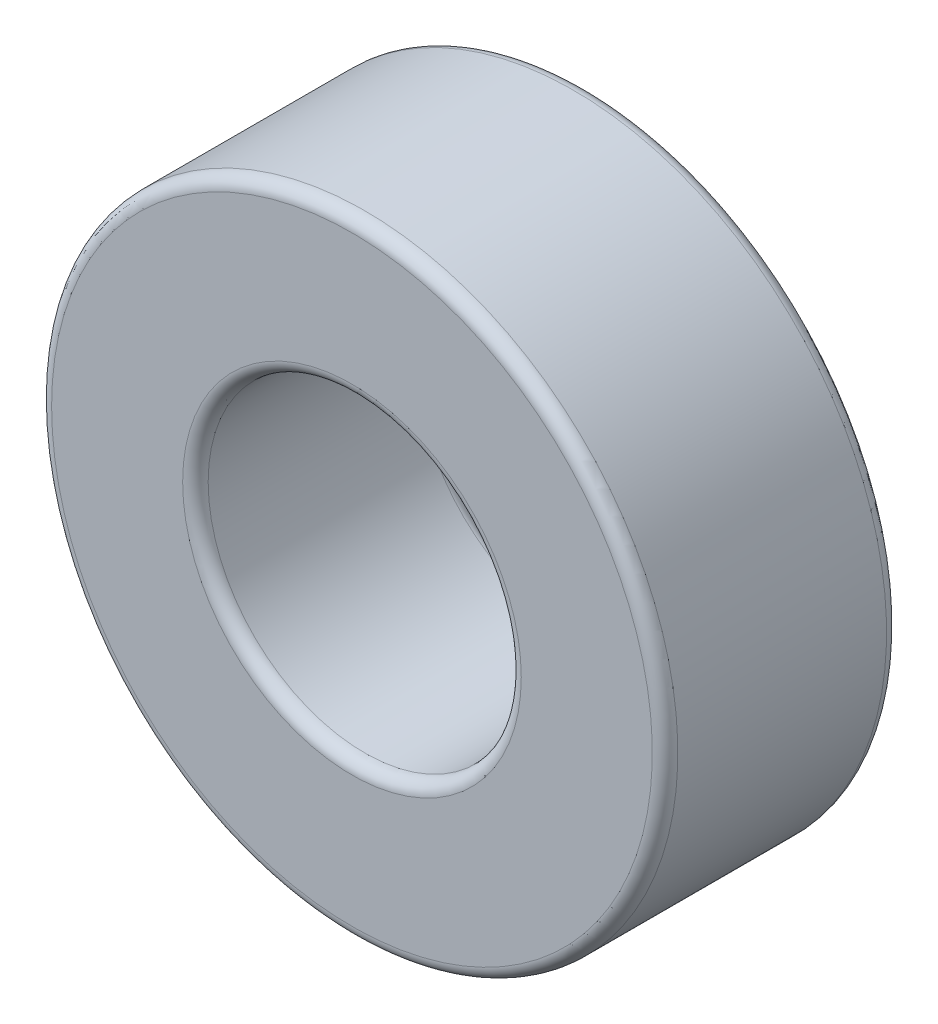
ISO-10303-21;
HEADER;
FILE_DESCRIPTION(('STEP AP214'),'2;1');
FILE_NAME('part.step','',(''),(''),'','','');
FILE_SCHEMA(('AUTOMOTIVE_DESIGN { 1 0 10303 214 1 1 1 1 }'));
ENDSEC;
DATA;
#1=APPLICATION_CONTEXT('core data for automotive mechanical design processes');
#2=APPLICATION_PROTOCOL_DEFINITION('international standard','automotive_design',2000,#1);
#3=PRODUCT_CONTEXT('',#1,'mechanical');
#4=PRODUCT('Part','Part','',(#3));
#5=PRODUCT_RELATED_PRODUCT_CATEGORY('part','',(#4));
#6=PRODUCT_DEFINITION_FORMATION('','',#4);
#7=PRODUCT_DEFINITION_CONTEXT('part definition',#1,'design');
#8=PRODUCT_DEFINITION('design','',#6,#7);
#9=PRODUCT_DEFINITION_SHAPE('','',#8);
#10=(LENGTH_UNIT() NAMED_UNIT(*) SI_UNIT(.MILLI.,.METRE.));
#11=(NAMED_UNIT(*) PLANE_ANGLE_UNIT() SI_UNIT($,.RADIAN.));
#12=(NAMED_UNIT(*) SI_UNIT($,.STERADIAN.) SOLID_ANGLE_UNIT());
#13=UNCERTAINTY_MEASURE_WITH_UNIT(LENGTH_MEASURE(1.E-05),#10,'distance_accuracy_value','');
#14=(GEOMETRIC_REPRESENTATION_CONTEXT(3) GLOBAL_UNCERTAINTY_ASSIGNED_CONTEXT((#13)) GLOBAL_UNIT_ASSIGNED_CONTEXT((#10,
#11,#12)) REPRESENTATION_CONTEXT('',''));
#15=CARTESIAN_POINT('',(0.,0.,0.));
#16=DIRECTION('',(0.,0.,1.));
#17=DIRECTION('',(1.,0.,0.));
#18=AXIS2_PLACEMENT_3D('',#15,#16,#17);
#19=CARTESIAN_POINT('',(-1.5,0.,0.));
#20=DIRECTION('',(0.,0.,-1.));
#21=DIRECTION('',(-1.,0.,0.));
#22=AXIS2_PLACEMENT_3D('',#19,#20,#21);
#23=TOROIDAL_SURFACE('',#22,1.62222222,0.12222222);
#24=CARTESIAN_POINT('',(-1.5,0.,0.12222222));
#25=DIRECTION('',(0.,0.,-1.));
#26=DIRECTION('',(-1.,0.,0.));
#27=AXIS2_PLACEMENT_3D('',#24,#25,#26);
#28=CIRCLE('',#27,1.62222222);
#29=CARTESIAN_POINT('',(-3.12222222,0.,0.12222222));
#30=VERTEX_POINT('',#29);
#31=EDGE_CURVE('E10',#30,#30,#28,.T.);
#32=ORIENTED_EDGE('',*,*,#31,.F.);
#33=EDGE_LOOP('',(#32));
#34=FACE_BOUND('',#33,.T.);
#35=CARTESIAN_POINT('',(-1.5,0.,0.));
#36=DIRECTION('',(0.,0.,-1.));
#37=DIRECTION('',(-1.,0.,0.));
#38=AXIS2_PLACEMENT_3D('',#35,#36,#37);
#39=CIRCLE('',#38,1.5);
#40=CARTESIAN_POINT('',(-3.,0.,0.));
#41=VERTEX_POINT('',#40);
#42=EDGE_CURVE('E58',#41,#41,#39,.T.);
#43=ORIENTED_EDGE('',*,*,#42,.T.);
#44=EDGE_LOOP('',(#43));
#45=FACE_BOUND('',#44,.T.);
#46=ADVANCED_FACE('F30',(#34,#45),#23,.T.);
#47=CARTESIAN_POINT('',(0.12222222,0.,0.12222222));
#48=DIRECTION('',(0.,0.,-1.));
#49=DIRECTION('',(-1.,0.,0.));
#50=AXIS2_PLACEMENT_3D('',#47,#48,#49);
#51=PLANE('',#50);
#52=CARTESIAN_POINT('',(-1.5,0.,0.12222222));
#53=DIRECTION('',(0.,0.,-1.));
#54=DIRECTION('',(-1.,0.,0.));
#55=AXIS2_PLACEMENT_3D('',#52,#53,#54);
#56=CIRCLE('',#55,2.87777778);
#57=CARTESIAN_POINT('',(-4.37777778,0.,0.12222222));
#58=VERTEX_POINT('',#57);
#59=EDGE_CURVE('E36',#58,#58,#56,.T.);
#60=ORIENTED_EDGE('',*,*,#59,.F.);
#61=EDGE_LOOP('',(#60));
#62=FACE_BOUND('',#61,.T.);
#63=ORIENTED_EDGE('',*,*,#31,.T.);
#64=EDGE_LOOP('',(#63));
#65=FACE_BOUND('',#64,.T.);
#66=ADVANCED_FACE('F95',(#62,#65),#51,.F.);
#67=CARTESIAN_POINT('',(-1.5,0.,0.));
#68=DIRECTION('',(0.,0.,-1.));
#69=DIRECTION('',(-1.,0.,0.));
#70=AXIS2_PLACEMENT_3D('',#67,#68,#69);
#71=TOROIDAL_SURFACE('',#70,2.87777778,0.12222222);
#72=CARTESIAN_POINT('',(-1.5,0.,-2.77639682078057E-08));
#73=DIRECTION('',(0.,0.,-1.));
#74=DIRECTION('',(-1.,0.,0.));
#75=AXIS2_PLACEMENT_3D('',#72,#73,#74);
#76=CIRCLE('',#75,3.);
#77=CARTESIAN_POINT('',(-4.5,0.,-2.77639682078057E-08));
#78=VERTEX_POINT('',#77);
#79=EDGE_CURVE('E40',#78,#78,#76,.T.);
#80=ORIENTED_EDGE('',*,*,#79,.F.);
#81=EDGE_LOOP('',(#80));
#82=FACE_BOUND('',#81,.T.);
#83=ORIENTED_EDGE('',*,*,#59,.T.);
#84=EDGE_LOOP('',(#83));
#85=FACE_BOUND('',#84,.T.);
#86=ADVANCED_FACE('F90',(#82,#85),#71,.T.);
#87=CARTESIAN_POINT('',(-1.5,0.,-2.));
#88=DIRECTION('',(0.,0.,-1.));
#89=DIRECTION('',(-1.,0.,0.));
#90=AXIS2_PLACEMENT_3D('',#87,#88,#89);
#91=CYLINDRICAL_SURFACE('',#90,2.99999977284025);
#92=CARTESIAN_POINT('',(-1.5,0.,-2.00000002776392));
#93=DIRECTION('',(0.,0.,-1.));
#94=DIRECTION('',(-1.,0.,0.));
#95=AXIS2_PLACEMENT_3D('',#92,#93,#94);
#96=CIRCLE('',#95,2.9999995456805);
#97=CARTESIAN_POINT('',(-4.4999995456805,0.,-2.00000002776392));
#98=VERTEX_POINT('',#97);
#99=EDGE_CURVE('E44',#98,#98,#96,.T.);
#100=ORIENTED_EDGE('',*,*,#99,.F.);
#101=EDGE_LOOP('',(#100));
#102=FACE_BOUND('',#101,.T.);
#103=ORIENTED_EDGE('',*,*,#79,.T.);
#104=EDGE_LOOP('',(#103));
#105=FACE_BOUND('',#104,.T.);
#106=ADVANCED_FACE('F84',(#102,#105),#91,.T.);
#107=CARTESIAN_POINT('',(-1.5,0.,-2.));
#108=DIRECTION('',(0.,0.,-1.));
#109=DIRECTION('',(-1.,0.,0.));
#110=AXIS2_PLACEMENT_3D('',#107,#108,#109);
#111=TOROIDAL_SURFACE('',#110,2.8777775456805,0.122222);
#112=CARTESIAN_POINT('',(-1.5,0.,-2.122222));
#113=DIRECTION('',(0.,0.,-1.));
#114=DIRECTION('',(-1.,0.,0.));
#115=AXIS2_PLACEMENT_3D('',#112,#113,#114);
#116=CIRCLE('',#115,2.8777775456805);
#117=CARTESIAN_POINT('',(-4.3777775456805,0.,-2.122222));
#118=VERTEX_POINT('',#117);
#119=EDGE_CURVE('E49',#118,#118,#116,.T.);
#120=ORIENTED_EDGE('',*,*,#119,.F.);
#121=EDGE_LOOP('',(#120));
#122=FACE_BOUND('',#121,.T.);
#123=ORIENTED_EDGE('',*,*,#99,.T.);
#124=EDGE_LOOP('',(#123));
#125=FACE_BOUND('',#124,.T.);
#126=ADVANCED_FACE('F78',(#122,#125),#111,.T.);
#127=CARTESIAN_POINT('',(0.122221985680501,0.,-2.122222));
#128=DIRECTION('',(0.,0.,1.));
#129=DIRECTION('',(1.,0.,0.));
#130=AXIS2_PLACEMENT_3D('',#127,#128,#129);
#131=PLANE('',#130);
#132=CARTESIAN_POINT('',(-1.5,0.,-2.122222));
#133=DIRECTION('',(0.,0.,-1.));
#134=DIRECTION('',(-1.,0.,0.));
#135=AXIS2_PLACEMENT_3D('',#132,#133,#134);
#136=CIRCLE('',#135,1.6222219856805);
#137=CARTESIAN_POINT('',(-3.1222219856805,0.,-2.122222));
#138=VERTEX_POINT('',#137);
#139=EDGE_CURVE('E52',#138,#138,#136,.T.);
#140=ORIENTED_EDGE('',*,*,#139,.F.);
#141=EDGE_LOOP('',(#140));
#142=FACE_BOUND('',#141,.T.);
#143=ORIENTED_EDGE('',*,*,#119,.T.);
#144=EDGE_LOOP('',(#143));
#145=FACE_BOUND('',#144,.T.);
#146=ADVANCED_FACE('F72',(#142,#145),#131,.F.);
#147=CARTESIAN_POINT('',(-1.5,0.,-2.));
#148=DIRECTION('',(0.,0.,-1.));
#149=DIRECTION('',(-1.,0.,0.));
#150=AXIS2_PLACEMENT_3D('',#147,#148,#149);
#151=TOROIDAL_SURFACE('',#150,1.622222,0.122222);
#152=CARTESIAN_POINT('',(-1.5,0.,-2.));
#153=DIRECTION('',(0.,0.,-1.));
#154=DIRECTION('',(-1.,0.,0.));
#155=AXIS2_PLACEMENT_3D('',#152,#153,#154);
#156=CIRCLE('',#155,1.5);
#157=CARTESIAN_POINT('',(-3.,0.,-2.));
#158=VERTEX_POINT('',#157);
#159=EDGE_CURVE('E55',#158,#158,#156,.T.);
#160=ORIENTED_EDGE('',*,*,#159,.F.);
#161=EDGE_LOOP('',(#160));
#162=FACE_BOUND('',#161,.T.);
#163=ORIENTED_EDGE('',*,*,#139,.T.);
#164=EDGE_LOOP('',(#163));
#165=FACE_BOUND('',#164,.T.);
#166=ADVANCED_FACE('F66',(#162,#165),#151,.T.);
#167=CARTESIAN_POINT('',(-1.5,0.,-2.));
#168=DIRECTION('',(0.,0.,-1.));
#169=DIRECTION('',(-1.,0.,0.));
#170=AXIS2_PLACEMENT_3D('',#167,#168,#169);
#171=CYLINDRICAL_SURFACE('',#170,1.5);
#172=ORIENTED_EDGE('',*,*,#42,.F.);
#173=EDGE_LOOP('',(#172));
#174=FACE_BOUND('',#173,.T.);
#175=ORIENTED_EDGE('',*,*,#159,.T.);
#176=EDGE_LOOP('',(#175));
#177=FACE_BOUND('',#176,.T.);
#178=ADVANCED_FACE('F63',(#174,#177),#171,.F.);
#179=CLOSED_SHELL('',(#46,#66,#86,#106,#126,#146,#166,#178));
#180=MANIFOLD_SOLID_BREP('B2',#179);
#181=ADVANCED_BREP_SHAPE_REPRESENTATION('',(#18,#180),#14);
#182=SHAPE_DEFINITION_REPRESENTATION(#9,#181);
ENDSEC;
END-ISO-10303-21;
